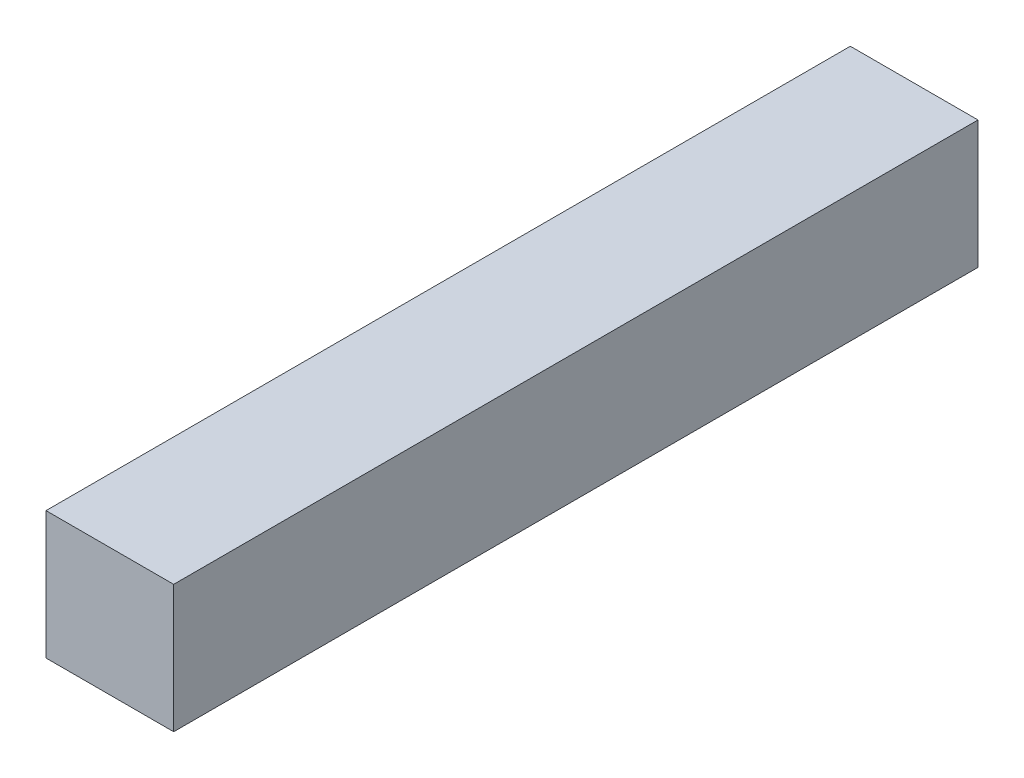
ISO-10303-21;
HEADER;
FILE_DESCRIPTION(('STEP AP214'),'2;1');
FILE_NAME('part.step','',(''),(''),'','','');
FILE_SCHEMA(('AUTOMOTIVE_DESIGN { 1 0 10303 214 1 1 1 1 }'));
ENDSEC;
DATA;
#1=APPLICATION_CONTEXT('core data for automotive mechanical design processes');
#2=APPLICATION_PROTOCOL_DEFINITION('international standard','automotive_design',2000,#1);
#3=PRODUCT_CONTEXT('',#1,'mechanical');
#4=PRODUCT('Part','Part','',(#3));
#5=PRODUCT_RELATED_PRODUCT_CATEGORY('part','',(#4));
#6=PRODUCT_DEFINITION_FORMATION('','',#4);
#7=PRODUCT_DEFINITION_CONTEXT('part definition',#1,'design');
#8=PRODUCT_DEFINITION('design','',#6,#7);
#9=PRODUCT_DEFINITION_SHAPE('','',#8);
#10=(LENGTH_UNIT() NAMED_UNIT(*) SI_UNIT(.MILLI.,.METRE.));
#11=(NAMED_UNIT(*) PLANE_ANGLE_UNIT() SI_UNIT($,.RADIAN.));
#12=(NAMED_UNIT(*) SI_UNIT($,.STERADIAN.) SOLID_ANGLE_UNIT());
#13=UNCERTAINTY_MEASURE_WITH_UNIT(LENGTH_MEASURE(1.E-05),#10,'distance_accuracy_value','');
#14=(GEOMETRIC_REPRESENTATION_CONTEXT(3) GLOBAL_UNCERTAINTY_ASSIGNED_CONTEXT((#13)) GLOBAL_UNIT_ASSIGNED_CONTEXT((#10,
#11,#12)) REPRESENTATION_CONTEXT('',''));
#15=CARTESIAN_POINT('',(0.,0.,0.));
#16=DIRECTION('',(0.,0.,1.));
#17=DIRECTION('',(1.,0.,0.));
#18=AXIS2_PLACEMENT_3D('',#15,#16,#17);
#19=CARTESIAN_POINT('',(2.38125,2.38125,-304.8));
#20=DIRECTION('',(1.,0.,0.));
#21=DIRECTION('',(0.,1.,0.));
#22=AXIS2_PLACEMENT_3D('',#19,#20,#21);
#23=PLANE('',#22);
#24=DIRECTION('',(0.,1.,0.));
#25=VECTOR('',#24,1.);
#26=CARTESIAN_POINT('',(2.38125,-2.38125,-325.537499999998));
#27=LINE('',#26,#25);
#28=CARTESIAN_POINT('',(2.38125,-2.38125,-325.537499999998));
#29=VERTEX_POINT('',#28);
#30=CARTESIAN_POINT('',(2.38125,2.38125,-325.537499999998));
#31=VERTEX_POINT('',#30);
#32=EDGE_CURVE('E56',#29,#31,#27,.T.);
#33=ORIENTED_EDGE('',*,*,#32,.T.);
#34=DIRECTION('',(0.,0.,1.));
#35=VECTOR('',#34,1.);
#36=CARTESIAN_POINT('',(2.38125,2.38125,-304.8));
#37=LINE('',#36,#35);
#38=CARTESIAN_POINT('',(2.38125,2.38125,-295.5375));
#39=VERTEX_POINT('',#38);
#40=EDGE_CURVE('E69',#39,#31,#37,.F.);
#41=ORIENTED_EDGE('',*,*,#40,.F.);
#42=DIRECTION('',(0.,1.,0.));
#43=VECTOR('',#42,1.);
#44=CARTESIAN_POINT('',(2.38125,-2.38125,-295.5375));
#45=LINE('',#44,#43);
#46=CARTESIAN_POINT('',(2.38125,-2.38125,-295.5375));
#47=VERTEX_POINT('',#46);
#48=EDGE_CURVE('E20',#47,#39,#45,.T.);
#49=ORIENTED_EDGE('',*,*,#48,.F.);
#50=DIRECTION('',(0.,0.,-1.));
#51=VECTOR('',#50,1.);
#52=CARTESIAN_POINT('',(2.38125,-2.38125,-304.8));
#53=LINE('',#52,#51);
#54=EDGE_CURVE('E91',#29,#47,#53,.F.);
#55=ORIENTED_EDGE('',*,*,#54,.F.);
#56=EDGE_LOOP('',(#33,#41,#49,#55));
#57=FACE_BOUND('',#56,.T.);
#58=ADVANCED_FACE('F17',(#57),#23,.T.);
#59=CARTESIAN_POINT('',(-2.38125,-2.38125,-295.5375));
#60=DIRECTION('',(0.,0.,1.));
#61=DIRECTION('',(1.,0.,0.));
#62=AXIS2_PLACEMENT_3D('',#59,#60,#61);
#63=PLANE('',#62);
#64=ORIENTED_EDGE('',*,*,#48,.T.);
#65=DIRECTION('',(1.,0.,0.));
#66=VECTOR('',#65,1.);
#67=CARTESIAN_POINT('',(-2.38125,2.38125,-295.5375));
#68=LINE('',#67,#66);
#69=CARTESIAN_POINT('',(-2.38125,2.38125,-295.5375));
#70=VERTEX_POINT('',#69);
#71=EDGE_CURVE('E63',#70,#39,#68,.T.);
#72=ORIENTED_EDGE('',*,*,#71,.F.);
#73=DIRECTION('',(0.,1.,0.));
#74=VECTOR('',#73,1.);
#75=CARTESIAN_POINT('',(-2.38125,2.38125,-295.5375));
#76=LINE('',#75,#74);
#77=CARTESIAN_POINT('',(-2.38125,-2.38125,-295.5375));
#78=VERTEX_POINT('',#77);
#79=EDGE_CURVE('E94',#78,#70,#76,.T.);
#80=ORIENTED_EDGE('',*,*,#79,.F.);
#81=DIRECTION('',(1.,0.,0.));
#82=VECTOR('',#81,1.);
#83=CARTESIAN_POINT('',(-2.38125,-2.38125,-295.5375));
#84=LINE('',#83,#82);
#85=EDGE_CURVE('E66',#47,#78,#84,.F.);
#86=ORIENTED_EDGE('',*,*,#85,.F.);
#87=EDGE_LOOP('',(#64,#72,#80,#86));
#88=FACE_BOUND('',#87,.T.);
#89=ADVANCED_FACE('F61',(#88),#63,.T.);
#90=CARTESIAN_POINT('',(-2.38125,2.38125,-304.8));
#91=DIRECTION('',(0.,1.,0.));
#92=DIRECTION('',(0.,0.,1.));
#93=AXIS2_PLACEMENT_3D('',#90,#91,#92);
#94=PLANE('',#93);
#95=DIRECTION('',(1.,0.,0.));
#96=VECTOR('',#95,1.);
#97=CARTESIAN_POINT('',(-2.38125,2.38125,-325.537499999998));
#98=LINE('',#97,#96);
#99=CARTESIAN_POINT('',(-2.38125,2.38125,-325.537499999998));
#100=VERTEX_POINT('',#99);
#101=EDGE_CURVE('E84',#31,#100,#98,.F.);
#102=ORIENTED_EDGE('',*,*,#101,.T.);
#103=DIRECTION('',(0.,0.,1.));
#104=VECTOR('',#103,1.);
#105=CARTESIAN_POINT('',(-2.38125,2.38125,-304.8));
#106=LINE('',#105,#104);
#107=EDGE_CURVE('E76',#70,#100,#106,.F.);
#108=ORIENTED_EDGE('',*,*,#107,.F.);
#109=ORIENTED_EDGE('',*,*,#71,.T.);
#110=ORIENTED_EDGE('',*,*,#40,.T.);
#111=EDGE_LOOP('',(#102,#108,#109,#110));
#112=FACE_BOUND('',#111,.T.);
#113=ADVANCED_FACE('F74',(#112),#94,.T.);
#114=CARTESIAN_POINT('',(-2.38125,-2.38125,-325.537499999998));
#115=DIRECTION('',(0.,0.,1.));
#116=DIRECTION('',(1.,0.,0.));
#117=AXIS2_PLACEMENT_3D('',#114,#115,#116);
#118=PLANE('',#117);
#119=ORIENTED_EDGE('',*,*,#101,.F.);
#120=ORIENTED_EDGE('',*,*,#32,.F.);
#121=DIRECTION('',(1.,0.,0.));
#122=VECTOR('',#121,1.);
#123=CARTESIAN_POINT('',(-2.38125,-2.38125,-325.537499999998));
#124=LINE('',#123,#122);
#125=CARTESIAN_POINT('',(-2.38125,-2.38125,-325.537499999998));
#126=VERTEX_POINT('',#125);
#127=EDGE_CURVE('E36',#126,#29,#124,.T.);
#128=ORIENTED_EDGE('',*,*,#127,.F.);
#129=DIRECTION('',(0.,1.,0.));
#130=VECTOR('',#129,1.);
#131=CARTESIAN_POINT('',(-2.38125,2.38125,-325.537499999998));
#132=LINE('',#131,#130);
#133=EDGE_CURVE('E27',#100,#126,#132,.F.);
#134=ORIENTED_EDGE('',*,*,#133,.F.);
#135=EDGE_LOOP('',(#119,#120,#128,#134));
#136=FACE_BOUND('',#135,.T.);
#137=ADVANCED_FACE('F102',(#136),#118,.F.);
#138=CARTESIAN_POINT('',(-2.38125,-2.38125,-304.8));
#139=DIRECTION('',(0.,-1.,0.));
#140=DIRECTION('',(0.,0.,-1.));
#141=AXIS2_PLACEMENT_3D('',#138,#139,#140);
#142=PLANE('',#141);
#143=ORIENTED_EDGE('',*,*,#127,.T.);
#144=ORIENTED_EDGE('',*,*,#54,.T.);
#145=ORIENTED_EDGE('',*,*,#85,.T.);
#146=DIRECTION('',(0.,0.,1.));
#147=VECTOR('',#146,1.);
#148=CARTESIAN_POINT('',(-2.38125,-2.38125,-304.8));
#149=LINE('',#148,#147);
#150=EDGE_CURVE('E11',#126,#78,#149,.T.);
#151=ORIENTED_EDGE('',*,*,#150,.F.);
#152=EDGE_LOOP('',(#143,#144,#145,#151));
#153=FACE_BOUND('',#152,.T.);
#154=ADVANCED_FACE('F104',(#153),#142,.T.);
#155=CARTESIAN_POINT('',(-2.38125,2.38125,-304.8));
#156=DIRECTION('',(-1.,0.,0.));
#157=DIRECTION('',(0.,0.,1.));
#158=AXIS2_PLACEMENT_3D('',#155,#156,#157);
#159=PLANE('',#158);
#160=ORIENTED_EDGE('',*,*,#133,.T.);
#161=ORIENTED_EDGE('',*,*,#150,.T.);
#162=ORIENTED_EDGE('',*,*,#79,.T.);
#163=ORIENTED_EDGE('',*,*,#107,.T.);
#164=EDGE_LOOP('',(#160,#161,#162,#163));
#165=FACE_BOUND('',#164,.T.);
#166=ADVANCED_FACE('F101',(#165),#159,.T.);
#167=CLOSED_SHELL('',(#58,#89,#113,#137,#154,#166));
#168=MANIFOLD_SOLID_BREP('B1',#167);
#169=ADVANCED_BREP_SHAPE_REPRESENTATION('',(#18,#168),#14);
#170=SHAPE_DEFINITION_REPRESENTATION(#9,#169);
ENDSEC;
END-ISO-10303-21;
